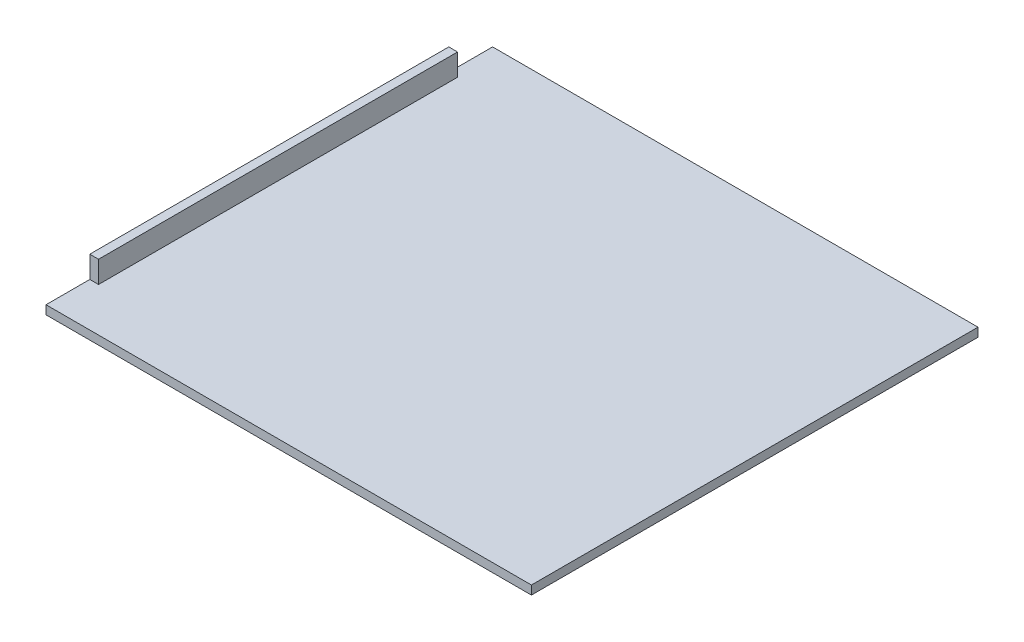
ISO-10303-21;
HEADER;
FILE_DESCRIPTION(('STEP AP214'),'2;1');
FILE_NAME('part.step','',(''),(''),'','','');
FILE_SCHEMA(('AUTOMOTIVE_DESIGN { 1 0 10303 214 1 1 1 1 }'));
ENDSEC;
DATA;
#1=APPLICATION_CONTEXT('core data for automotive mechanical design processes');
#2=APPLICATION_PROTOCOL_DEFINITION('international standard','automotive_design',2000,#1);
#3=PRODUCT_CONTEXT('',#1,'mechanical');
#4=PRODUCT('Part','Part','',(#3));
#5=PRODUCT_RELATED_PRODUCT_CATEGORY('part','',(#4));
#6=PRODUCT_DEFINITION_FORMATION('','',#4);
#7=PRODUCT_DEFINITION_CONTEXT('part definition',#1,'design');
#8=PRODUCT_DEFINITION('design','',#6,#7);
#9=PRODUCT_DEFINITION_SHAPE('','',#8);
#10=(LENGTH_UNIT() NAMED_UNIT(*) SI_UNIT(.MILLI.,.METRE.));
#11=(NAMED_UNIT(*) PLANE_ANGLE_UNIT() SI_UNIT($,.RADIAN.));
#12=(NAMED_UNIT(*) SI_UNIT($,.STERADIAN.) SOLID_ANGLE_UNIT());
#13=UNCERTAINTY_MEASURE_WITH_UNIT(LENGTH_MEASURE(1.E-05),#10,'distance_accuracy_value','');
#14=(GEOMETRIC_REPRESENTATION_CONTEXT(3) GLOBAL_UNCERTAINTY_ASSIGNED_CONTEXT((#13)) GLOBAL_UNIT_ASSIGNED_CONTEXT((#10,
#11,#12)) REPRESENTATION_CONTEXT('',''));
#15=CARTESIAN_POINT('',(0.,0.,0.));
#16=DIRECTION('',(0.,0.,1.));
#17=DIRECTION('',(1.,0.,0.));
#18=AXIS2_PLACEMENT_3D('',#15,#16,#17);
#19=CARTESIAN_POINT('',(55.435,2.,-51.));
#20=DIRECTION('',(-1.,0.,0.));
#21=DIRECTION('',(0.,0.,1.));
#22=AXIS2_PLACEMENT_3D('',#19,#20,#21);
#23=PLANE('',#22);
#24=DIRECTION('',(0.,0.,-1.));
#25=VECTOR('',#24,1.);
#26=CARTESIAN_POINT('',(55.435,0.,-51.));
#27=LINE('',#26,#25);
#28=CARTESIAN_POINT('',(55.435,0.,51.));
#29=VERTEX_POINT('',#28);
#30=CARTESIAN_POINT('',(55.435,0.,-51.));
#31=VERTEX_POINT('',#30);
#32=EDGE_CURVE('E133',#29,#31,#27,.T.);
#33=ORIENTED_EDGE('',*,*,#32,.T.);
#34=DIRECTION('',(0.,-1.,0.));
#35=VECTOR('',#34,1.);
#36=CARTESIAN_POINT('',(55.435,2.,-51.));
#37=LINE('',#36,#35);
#38=CARTESIAN_POINT('',(55.435,2.,-51.));
#39=VERTEX_POINT('',#38);
#40=EDGE_CURVE('E11',#39,#31,#37,.T.);
#41=ORIENTED_EDGE('',*,*,#40,.F.);
#42=DIRECTION('',(0.,0.,-1.));
#43=VECTOR('',#42,1.);
#44=CARTESIAN_POINT('',(55.435,2.,-51.));
#45=LINE('',#44,#43);
#46=CARTESIAN_POINT('',(55.435,2.,51.));
#47=VERTEX_POINT('',#46);
#48=EDGE_CURVE('E144',#47,#39,#45,.T.);
#49=ORIENTED_EDGE('',*,*,#48,.F.);
#50=DIRECTION('',(0.,-1.,0.));
#51=VECTOR('',#50,1.);
#52=CARTESIAN_POINT('',(55.435,2.,51.));
#53=LINE('',#52,#51);
#54=EDGE_CURVE('E157',#47,#29,#53,.T.);
#55=ORIENTED_EDGE('',*,*,#54,.T.);
#56=EDGE_LOOP('',(#33,#41,#49,#55));
#57=FACE_BOUND('',#56,.T.);
#58=ADVANCED_FACE('F43',(#57),#23,.F.);
#59=CARTESIAN_POINT('',(-55.435,2.,-51.));
#60=DIRECTION('',(0.,0.,1.));
#61=DIRECTION('',(1.,0.,0.));
#62=AXIS2_PLACEMENT_3D('',#59,#60,#61);
#63=PLANE('',#62);
#64=DIRECTION('',(-1.,0.,0.));
#65=VECTOR('',#64,1.);
#66=CARTESIAN_POINT('',(-55.435,0.,-51.));
#67=LINE('',#66,#65);
#68=CARTESIAN_POINT('',(-55.435,0.,-51.));
#69=VERTEX_POINT('',#68);
#70=EDGE_CURVE('E138',#31,#69,#67,.T.);
#71=ORIENTED_EDGE('',*,*,#70,.T.);
#72=DIRECTION('',(0.,-1.,0.));
#73=VECTOR('',#72,1.);
#74=CARTESIAN_POINT('',(-55.435,2.,-51.));
#75=LINE('',#74,#73);
#76=CARTESIAN_POINT('',(-55.435,2.,-51.));
#77=VERTEX_POINT('',#76);
#78=EDGE_CURVE('E51',#77,#69,#75,.T.);
#79=ORIENTED_EDGE('',*,*,#78,.F.);
#80=DIRECTION('',(-1.,0.,0.));
#81=VECTOR('',#80,1.);
#82=CARTESIAN_POINT('',(-55.435,2.,-51.));
#83=LINE('',#82,#81);
#84=EDGE_CURVE('E148',#39,#77,#83,.T.);
#85=ORIENTED_EDGE('',*,*,#84,.F.);
#86=ORIENTED_EDGE('',*,*,#40,.T.);
#87=EDGE_LOOP('',(#71,#79,#85,#86));
#88=FACE_BOUND('',#87,.T.);
#89=ADVANCED_FACE('F191',(#88),#63,.F.);
#90=CARTESIAN_POINT('',(-55.435,2.,-51.));
#91=DIRECTION('',(1.,0.,0.));
#92=DIRECTION('',(0.,0.,-1.));
#93=AXIS2_PLACEMENT_3D('',#90,#91,#92);
#94=PLANE('',#93);
#95=DIRECTION('',(0.,0.,1.));
#96=VECTOR('',#95,1.);
#97=CARTESIAN_POINT('',(-55.435,0.,-51.));
#98=LINE('',#97,#96);
#99=CARTESIAN_POINT('',(-55.435,0.,51.));
#100=VERTEX_POINT('',#99);
#101=EDGE_CURVE('E161',#69,#100,#98,.T.);
#102=ORIENTED_EDGE('',*,*,#101,.T.);
#103=DIRECTION('',(0.,-1.,0.));
#104=VECTOR('',#103,1.);
#105=CARTESIAN_POINT('',(-55.435,2.,51.));
#106=LINE('',#105,#104);
#107=CARTESIAN_POINT('',(-55.435,2.,51.));
#108=VERTEX_POINT('',#107);
#109=EDGE_CURVE('E169',#108,#100,#106,.T.);
#110=ORIENTED_EDGE('',*,*,#109,.F.);
#111=DIRECTION('',(0.,0.,1.));
#112=VECTOR('',#111,1.);
#113=CARTESIAN_POINT('',(-55.435,2.,-51.));
#114=LINE('',#113,#112);
#115=CARTESIAN_POINT('',(-55.435,2.,41.));
#116=VERTEX_POINT('',#115);
#117=EDGE_CURVE('E131',#116,#108,#114,.T.);
#118=ORIENTED_EDGE('',*,*,#117,.F.);
#119=DIRECTION('',(0.,-1.,0.));
#120=VECTOR('',#119,1.);
#121=CARTESIAN_POINT('',(-55.435,7.,41.));
#122=LINE('',#121,#120);
#123=CARTESIAN_POINT('',(-55.435,7.,41.));
#124=VERTEX_POINT('',#123);
#125=EDGE_CURVE('E111',#124,#116,#122,.T.);
#126=ORIENTED_EDGE('',*,*,#125,.F.);
#127=DIRECTION('',(0.,0.,1.));
#128=VECTOR('',#127,1.);
#129=CARTESIAN_POINT('',(-55.435,7.,-41.));
#130=LINE('',#129,#128);
#131=CARTESIAN_POINT('',(-55.435,7.,-41.));
#132=VERTEX_POINT('',#131);
#133=EDGE_CURVE('E118',#132,#124,#130,.T.);
#134=ORIENTED_EDGE('',*,*,#133,.F.);
#135=DIRECTION('',(0.,-1.,0.));
#136=VECTOR('',#135,1.);
#137=CARTESIAN_POINT('',(-55.435,7.,-41.));
#138=LINE('',#137,#136);
#139=CARTESIAN_POINT('',(-55.435,2.,-41.));
#140=VERTEX_POINT('',#139);
#141=EDGE_CURVE('E298',#132,#140,#138,.T.);
#142=ORIENTED_EDGE('',*,*,#141,.T.);
#143=EDGE_CURVE('E152',#77,#140,#114,.T.);
#144=ORIENTED_EDGE('',*,*,#143,.F.);
#145=ORIENTED_EDGE('',*,*,#78,.T.);
#146=EDGE_LOOP('',(#102,#110,#118,#126,#134,#142,#144,#145));
#147=FACE_BOUND('',#146,.T.);
#148=ADVANCED_FACE('F129',(#147),#94,.F.);
#149=CARTESIAN_POINT('',(-55.435,2.,51.));
#150=DIRECTION('',(0.,0.,-1.));
#151=DIRECTION('',(-1.,0.,0.));
#152=AXIS2_PLACEMENT_3D('',#149,#150,#151);
#153=PLANE('',#152);
#154=DIRECTION('',(1.,0.,0.));
#155=VECTOR('',#154,1.);
#156=CARTESIAN_POINT('',(-55.435,0.,51.));
#157=LINE('',#156,#155);
#158=EDGE_CURVE('E149',#100,#29,#157,.T.);
#159=ORIENTED_EDGE('',*,*,#158,.T.);
#160=ORIENTED_EDGE('',*,*,#54,.F.);
#161=DIRECTION('',(1.,0.,0.));
#162=VECTOR('',#161,1.);
#163=CARTESIAN_POINT('',(-55.435,2.,51.));
#164=LINE('',#163,#162);
#165=EDGE_CURVE('E155',#108,#47,#164,.T.);
#166=ORIENTED_EDGE('',*,*,#165,.F.);
#167=ORIENTED_EDGE('',*,*,#109,.T.);
#168=EDGE_LOOP('',(#159,#160,#166,#167));
#169=FACE_BOUND('',#168,.T.);
#170=ADVANCED_FACE('F184',(#169),#153,.F.);
#171=CARTESIAN_POINT('',(0.,2.,0.));
#172=DIRECTION('',(0.,1.,0.));
#173=DIRECTION('',(0.,0.,1.));
#174=AXIS2_PLACEMENT_3D('',#171,#172,#173);
#175=PLANE('',#174);
#176=DIRECTION('',(-1.,0.,0.));
#177=VECTOR('',#176,1.);
#178=CARTESIAN_POINT('',(-55.435,2.,-41.));
#179=LINE('',#178,#177);
#180=CARTESIAN_POINT('',(-53.435,2.,-41.));
#181=VERTEX_POINT('',#180);
#182=EDGE_CURVE('E58',#181,#140,#179,.T.);
#183=ORIENTED_EDGE('',*,*,#182,.F.);
#184=DIRECTION('',(0.,0.,-1.));
#185=VECTOR('',#184,1.);
#186=CARTESIAN_POINT('',(-53.435,2.,-41.));
#187=LINE('',#186,#185);
#188=CARTESIAN_POINT('',(-53.435,2.,41.));
#189=VERTEX_POINT('',#188);
#190=EDGE_CURVE('E301',#189,#181,#187,.T.);
#191=ORIENTED_EDGE('',*,*,#190,.F.);
#192=DIRECTION('',(1.,0.,0.));
#193=VECTOR('',#192,1.);
#194=CARTESIAN_POINT('',(-55.435,2.,41.));
#195=LINE('',#194,#193);
#196=EDGE_CURVE('E64',#116,#189,#195,.T.);
#197=ORIENTED_EDGE('',*,*,#196,.F.);
#198=ORIENTED_EDGE('',*,*,#117,.T.);
#199=ORIENTED_EDGE('',*,*,#165,.T.);
#200=ORIENTED_EDGE('',*,*,#48,.T.);
#201=ORIENTED_EDGE('',*,*,#84,.T.);
#202=ORIENTED_EDGE('',*,*,#143,.T.);
#203=EDGE_LOOP('',(#183,#191,#197,#198,#199,#200,#201,#202));
#204=FACE_BOUND('',#203,.T.);
#205=ADVANCED_FACE('F189',(#204),#175,.T.);
#206=CARTESIAN_POINT('',(0.,0.,0.));
#207=DIRECTION('',(0.,1.,0.));
#208=DIRECTION('',(0.,0.,1.));
#209=AXIS2_PLACEMENT_3D('',#206,#207,#208);
#210=PLANE('',#209);
#211=ORIENTED_EDGE('',*,*,#32,.F.);
#212=ORIENTED_EDGE('',*,*,#158,.F.);
#213=ORIENTED_EDGE('',*,*,#101,.F.);
#214=ORIENTED_EDGE('',*,*,#70,.F.);
#215=EDGE_LOOP('',(#211,#212,#213,#214));
#216=FACE_BOUND('',#215,.T.);
#217=ADVANCED_FACE('F181',(#216),#210,.F.);
#218=CARTESIAN_POINT('',(-55.435,7.,41.));
#219=DIRECTION('',(0.,0.,-1.));
#220=DIRECTION('',(-1.,0.,0.));
#221=AXIS2_PLACEMENT_3D('',#218,#219,#220);
#222=PLANE('',#221);
#223=ORIENTED_EDGE('',*,*,#196,.T.);
#224=DIRECTION('',(0.,-1.,0.));
#225=VECTOR('',#224,1.);
#226=CARTESIAN_POINT('',(-53.435,7.,41.));
#227=LINE('',#226,#225);
#228=CARTESIAN_POINT('',(-53.435,7.,41.));
#229=VERTEX_POINT('',#228);
#230=EDGE_CURVE('E113',#229,#189,#227,.T.);
#231=ORIENTED_EDGE('',*,*,#230,.F.);
#232=DIRECTION('',(1.,0.,0.));
#233=VECTOR('',#232,1.);
#234=CARTESIAN_POINT('',(-55.435,7.,41.));
#235=LINE('',#234,#233);
#236=EDGE_CURVE('E107',#124,#229,#235,.T.);
#237=ORIENTED_EDGE('',*,*,#236,.F.);
#238=ORIENTED_EDGE('',*,*,#125,.T.);
#239=EDGE_LOOP('',(#223,#231,#237,#238));
#240=FACE_BOUND('',#239,.T.);
#241=ADVANCED_FACE('F109',(#240),#222,.F.);
#242=CARTESIAN_POINT('',(-53.435,7.,-41.));
#243=DIRECTION('',(-1.,0.,0.));
#244=DIRECTION('',(0.,0.,1.));
#245=AXIS2_PLACEMENT_3D('',#242,#243,#244);
#246=PLANE('',#245);
#247=ORIENTED_EDGE('',*,*,#190,.T.);
#248=DIRECTION('',(0.,-1.,0.));
#249=VECTOR('',#248,1.);
#250=CARTESIAN_POINT('',(-53.435,7.,-41.));
#251=LINE('',#250,#249);
#252=CARTESIAN_POINT('',(-53.435,7.,-41.));
#253=VERTEX_POINT('',#252);
#254=EDGE_CURVE('E140',#253,#181,#251,.T.);
#255=ORIENTED_EDGE('',*,*,#254,.F.);
#256=DIRECTION('',(0.,0.,-1.));
#257=VECTOR('',#256,1.);
#258=CARTESIAN_POINT('',(-53.435,7.,-41.));
#259=LINE('',#258,#257);
#260=EDGE_CURVE('E117',#229,#253,#259,.T.);
#261=ORIENTED_EDGE('',*,*,#260,.F.);
#262=ORIENTED_EDGE('',*,*,#230,.T.);
#263=EDGE_LOOP('',(#247,#255,#261,#262));
#264=FACE_BOUND('',#263,.T.);
#265=ADVANCED_FACE('F207',(#264),#246,.F.);
#266=CARTESIAN_POINT('',(-55.435,7.,-41.));
#267=DIRECTION('',(0.,0.,1.));
#268=DIRECTION('',(1.,0.,0.));
#269=AXIS2_PLACEMENT_3D('',#266,#267,#268);
#270=PLANE('',#269);
#271=ORIENTED_EDGE('',*,*,#182,.T.);
#272=ORIENTED_EDGE('',*,*,#141,.F.);
#273=DIRECTION('',(-1.,0.,0.));
#274=VECTOR('',#273,1.);
#275=CARTESIAN_POINT('',(-55.435,7.,-41.));
#276=LINE('',#275,#274);
#277=EDGE_CURVE('E123',#253,#132,#276,.T.);
#278=ORIENTED_EDGE('',*,*,#277,.F.);
#279=ORIENTED_EDGE('',*,*,#254,.T.);
#280=EDGE_LOOP('',(#271,#272,#278,#279));
#281=FACE_BOUND('',#280,.T.);
#282=ADVANCED_FACE('F210',(#281),#270,.F.);
#283=CARTESIAN_POINT('',(0.,7.,0.));
#284=DIRECTION('',(0.,1.,0.));
#285=DIRECTION('',(0.,0.,1.));
#286=AXIS2_PLACEMENT_3D('',#283,#284,#285);
#287=PLANE('',#286);
#288=ORIENTED_EDGE('',*,*,#133,.T.);
#289=ORIENTED_EDGE('',*,*,#236,.T.);
#290=ORIENTED_EDGE('',*,*,#260,.T.);
#291=ORIENTED_EDGE('',*,*,#277,.T.);
#292=EDGE_LOOP('',(#288,#289,#290,#291));
#293=FACE_BOUND('',#292,.T.);
#294=ADVANCED_FACE('F121',(#293),#287,.T.);
#295=CLOSED_SHELL('',(#58,#89,#148,#170,#205,#217,#241,#265,#282,#294));
#296=MANIFOLD_SOLID_BREP('B2',#295);
#297=ADVANCED_BREP_SHAPE_REPRESENTATION('',(#18,#296),#14);
#298=SHAPE_DEFINITION_REPRESENTATION(#9,#297);
ENDSEC;
END-ISO-10303-21;
